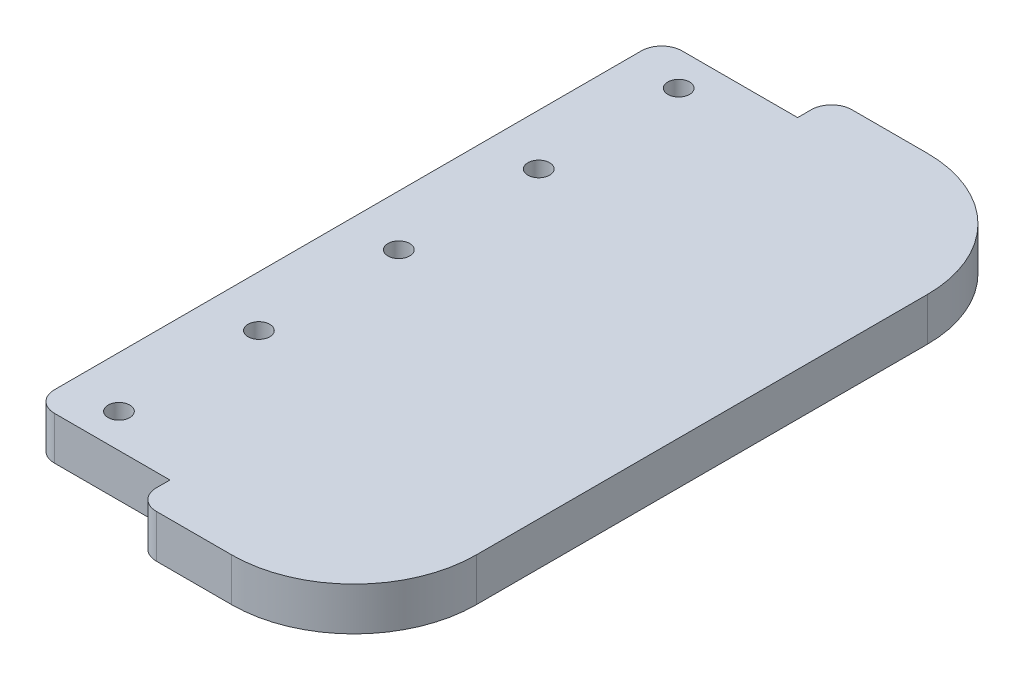
ISO-10303-21;
HEADER;
FILE_DESCRIPTION(('STEP AP214'),'2;1');
FILE_NAME('part.step','',(''),(''),'','','');
FILE_SCHEMA(('AUTOMOTIVE_DESIGN { 1 0 10303 214 1 1 1 1 }'));
ENDSEC;
DATA;
#1=APPLICATION_CONTEXT('core data for automotive mechanical design processes');
#2=APPLICATION_PROTOCOL_DEFINITION('international standard','automotive_design',2000,#1);
#3=PRODUCT_CONTEXT('',#1,'mechanical');
#4=PRODUCT('Part','Part','',(#3));
#5=PRODUCT_RELATED_PRODUCT_CATEGORY('part','',(#4));
#6=PRODUCT_DEFINITION_FORMATION('','',#4);
#7=PRODUCT_DEFINITION_CONTEXT('part definition',#1,'design');
#8=PRODUCT_DEFINITION('design','',#6,#7);
#9=PRODUCT_DEFINITION_SHAPE('','',#8);
#10=(LENGTH_UNIT() NAMED_UNIT(*) SI_UNIT(.MILLI.,.METRE.));
#11=(NAMED_UNIT(*) PLANE_ANGLE_UNIT() SI_UNIT($,.RADIAN.));
#12=(NAMED_UNIT(*) SI_UNIT($,.STERADIAN.) SOLID_ANGLE_UNIT());
#13=UNCERTAINTY_MEASURE_WITH_UNIT(LENGTH_MEASURE(1.E-05),#10,'distance_accuracy_value','');
#14=(GEOMETRIC_REPRESENTATION_CONTEXT(3) GLOBAL_UNCERTAINTY_ASSIGNED_CONTEXT((#13)) GLOBAL_UNIT_ASSIGNED_CONTEXT((#10,
#11,#12)) REPRESENTATION_CONTEXT('',''));
#15=CARTESIAN_POINT('',(0.,0.,0.));
#16=DIRECTION('',(0.,0.,1.));
#17=DIRECTION('',(1.,0.,0.));
#18=AXIS2_PLACEMENT_3D('',#15,#16,#17);
#19=CARTESIAN_POINT('',(0.,6.35,0.));
#20=DIRECTION('',(-1.,0.,0.));
#21=DIRECTION('',(0.,0.,1.));
#22=AXIS2_PLACEMENT_3D('',#19,#20,#21);
#23=PLANE('',#22);
#24=DIRECTION('',(0.,0.,-1.));
#25=VECTOR('',#24,1.);
#26=CARTESIAN_POINT('',(0.,6.35,0.));
#27=LINE('',#26,#25);
#28=CARTESIAN_POINT('',(0.,6.35,-8.));
#29=VERTEX_POINT('',#28);
#30=CARTESIAN_POINT('',(0.,6.35,-94.362));
#31=VERTEX_POINT('',#30);
#32=EDGE_CURVE('E256',#29,#31,#27,.T.);
#33=ORIENTED_EDGE('',*,*,#32,.T.);
#34=DIRECTION('',(0.,-1.,0.));
#35=VECTOR('',#34,1.);
#36=CARTESIAN_POINT('',(0.,6.35,-94.362));
#37=LINE('',#36,#35);
#38=CARTESIAN_POINT('',(0.,0.,-94.362));
#39=VERTEX_POINT('',#38);
#40=EDGE_CURVE('E343',#31,#39,#37,.T.);
#41=ORIENTED_EDGE('',*,*,#40,.T.);
#42=DIRECTION('',(0.,0.,-1.));
#43=VECTOR('',#42,1.);
#44=CARTESIAN_POINT('',(0.,0.,0.));
#45=LINE('',#44,#43);
#46=CARTESIAN_POINT('',(0.,0.,-8.));
#47=VERTEX_POINT('',#46);
#48=EDGE_CURVE('E252',#47,#39,#45,.T.);
#49=ORIENTED_EDGE('',*,*,#48,.F.);
#50=DIRECTION('',(0.,-1.,0.));
#51=VECTOR('',#50,1.);
#52=CARTESIAN_POINT('',(0.,6.35,-8.));
#53=LINE('',#52,#51);
#54=EDGE_CURVE('E340',#47,#29,#53,.F.);
#55=ORIENTED_EDGE('',*,*,#54,.T.);
#56=EDGE_LOOP('',(#33,#41,#49,#55));
#57=FACE_BOUND('',#56,.T.);
#58=ADVANCED_FACE('F41',(#57),#23,.T.);
#59=CARTESIAN_POINT('',(0.,6.35,0.));
#60=DIRECTION('',(0.,0.,-1.));
#61=DIRECTION('',(-1.,0.,0.));
#62=AXIS2_PLACEMENT_3D('',#59,#60,#61);
#63=PLANE('',#62);
#64=DIRECTION('',(1.,0.,0.));
#65=VECTOR('',#64,1.);
#66=CARTESIAN_POINT('',(0.,6.35,0.));
#67=LINE('',#66,#65);
#68=CARTESIAN_POINT('',(23.,6.35,0.));
#69=VERTEX_POINT('',#68);
#70=CARTESIAN_POINT('',(34.084,6.35,0.));
#71=VERTEX_POINT('',#70);
#72=EDGE_CURVE('E267',#69,#71,#67,.T.);
#73=ORIENTED_EDGE('',*,*,#72,.F.);
#74=DIRECTION('',(0.,-1.,0.));
#75=VECTOR('',#74,1.);
#76=CARTESIAN_POINT('',(23.,0.,0.));
#77=LINE('',#76,#75);
#78=CARTESIAN_POINT('',(23.,0.,0.));
#79=VERTEX_POINT('',#78);
#80=EDGE_CURVE('E50',#69,#79,#77,.T.);
#81=ORIENTED_EDGE('',*,*,#80,.T.);
#82=DIRECTION('',(1.,0.,0.));
#83=VECTOR('',#82,1.);
#84=CARTESIAN_POINT('',(0.,0.,0.));
#85=LINE('',#84,#83);
#86=CARTESIAN_POINT('',(34.084,0.,0.));
#87=VERTEX_POINT('',#86);
#88=EDGE_CURVE('E260',#79,#87,#85,.T.);
#89=ORIENTED_EDGE('',*,*,#88,.T.);
#90=DIRECTION('',(0.,-1.,0.));
#91=VECTOR('',#90,1.);
#92=CARTESIAN_POINT('',(34.084,6.35,0.));
#93=LINE('',#92,#91);
#94=EDGE_CURVE('E296',#87,#71,#93,.F.);
#95=ORIENTED_EDGE('',*,*,#94,.T.);
#96=EDGE_LOOP('',(#73,#81,#89,#95));
#97=FACE_BOUND('',#96,.T.);
#98=ADVANCED_FACE('F358',(#97),#63,.F.);
#99=CARTESIAN_POINT('',(0.,6.35,0.));
#100=DIRECTION('',(0.,-1.,0.));
#101=DIRECTION('',(0.,0.,-1.));
#102=AXIS2_PLACEMENT_3D('',#99,#100,#101);
#103=PLANE('',#102);
#104=CARTESIAN_POINT('',(7.50000000000086,6.35,-10.002));
#105=DIRECTION('',(0.,1.,0.));
#106=DIRECTION('',(0.,0.,1.));
#107=AXIS2_PLACEMENT_3D('',#104,#105,#106);
#108=CIRCLE('',#107,1.6);
#109=CARTESIAN_POINT('',(7.50000000000086,6.35,-8.40200000000001));
#110=VERTEX_POINT('',#109);
#111=EDGE_CURVE('E215',#110,#110,#108,.T.);
#112=ORIENTED_EDGE('',*,*,#111,.F.);
#113=EDGE_LOOP('',(#112));
#114=FACE_BOUND('',#113,.T.);
#115=CARTESIAN_POINT('',(7.50000000000065,6.35,-30.592));
#116=DIRECTION('',(0.,1.,0.));
#117=DIRECTION('',(0.,0.,1.));
#118=AXIS2_PLACEMENT_3D('',#115,#116,#117);
#119=CIRCLE('',#118,1.6);
#120=CARTESIAN_POINT('',(7.50000000000065,6.35,-28.992));
#121=VERTEX_POINT('',#120);
#122=EDGE_CURVE('E237',#121,#121,#119,.T.);
#123=ORIENTED_EDGE('',*,*,#122,.F.);
#124=EDGE_LOOP('',(#123));
#125=FACE_BOUND('',#124,.T.);
#126=CARTESIAN_POINT('',(7.50000000000043,6.35,-51.182));
#127=DIRECTION('',(0.,1.,0.));
#128=DIRECTION('',(0.,0.,1.));
#129=AXIS2_PLACEMENT_3D('',#126,#127,#128);
#130=CIRCLE('',#129,1.6);
#131=CARTESIAN_POINT('',(7.50000000000043,6.35,-49.582));
#132=VERTEX_POINT('',#131);
#133=EDGE_CURVE('E229',#132,#132,#130,.T.);
#134=ORIENTED_EDGE('',*,*,#133,.F.);
#135=EDGE_LOOP('',(#134));
#136=FACE_BOUND('',#135,.T.);
#137=CARTESIAN_POINT('',(7.5,6.35,-92.362));
#138=DIRECTION('',(0.,1.,0.));
#139=DIRECTION('',(0.,0.,1.));
#140=AXIS2_PLACEMENT_3D('',#137,#138,#139);
#141=CIRCLE('',#140,1.6);
#142=CARTESIAN_POINT('',(7.5,6.35,-90.762));
#143=VERTEX_POINT('',#142);
#144=EDGE_CURVE('E221',#143,#143,#141,.T.);
#145=ORIENTED_EDGE('',*,*,#144,.F.);
#146=EDGE_LOOP('',(#145));
#147=FACE_BOUND('',#146,.T.);
#148=CARTESIAN_POINT('',(7.50000000000022,6.35,-71.772));
#149=DIRECTION('',(0.,1.,0.));
#150=DIRECTION('',(0.,0.,1.));
#151=AXIS2_PLACEMENT_3D('',#148,#149,#150);
#152=CIRCLE('',#151,1.6);
#153=CARTESIAN_POINT('',(7.50000000000022,6.35,-70.172));
#154=VERTEX_POINT('',#153);
#155=EDGE_CURVE('E248',#154,#154,#152,.T.);
#156=ORIENTED_EDGE('',*,*,#155,.F.);
#157=EDGE_LOOP('',(#156));
#158=FACE_BOUND('',#157,.T.);
#159=DIRECTION('',(1.,0.,0.));
#160=VECTOR('',#159,1.);
#161=CARTESIAN_POINT('',(0.,6.35,-102.362));
#162=LINE('',#161,#160);
#163=CARTESIAN_POINT('',(23.,6.35,-102.362));
#164=VERTEX_POINT('',#163);
#165=CARTESIAN_POINT('',(34.084,6.35,-102.362));
#166=VERTEX_POINT('',#165);
#167=EDGE_CURVE('E259',#164,#166,#162,.T.);
#168=ORIENTED_EDGE('',*,*,#167,.F.);
#169=CARTESIAN_POINT('',(23.,6.35,-99.362));
#170=DIRECTION('',(0.,-1.,0.));
#171=DIRECTION('',(0.,0.,-1.));
#172=AXIS2_PLACEMENT_3D('',#169,#170,#171);
#173=CIRCLE('',#172,3.);
#174=CARTESIAN_POINT('',(20.,6.35,-99.362));
#175=VERTEX_POINT('',#174);
#176=EDGE_CURVE('E337',#164,#175,#173,.F.);
#177=ORIENTED_EDGE('',*,*,#176,.T.);
#178=DIRECTION('',(0.,0.,1.));
#179=VECTOR('',#178,1.);
#180=CARTESIAN_POINT('',(20.,6.35,-102.362));
#181=LINE('',#180,#179);
#182=CARTESIAN_POINT('',(20.,6.35,-97.362));
#183=VERTEX_POINT('',#182);
#184=EDGE_CURVE('E179',#175,#183,#181,.T.);
#185=ORIENTED_EDGE('',*,*,#184,.T.);
#186=DIRECTION('',(1.,0.,0.));
#187=VECTOR('',#186,1.);
#188=CARTESIAN_POINT('',(0.,6.35,-97.362));
#189=LINE('',#188,#187);
#190=CARTESIAN_POINT('',(3.,6.35,-97.362));
#191=VERTEX_POINT('',#190);
#192=EDGE_CURVE('E184',#191,#183,#189,.T.);
#193=ORIENTED_EDGE('',*,*,#192,.F.);
#194=CARTESIAN_POINT('',(3.,6.35,-94.362));
#195=DIRECTION('',(0.,-1.,0.));
#196=DIRECTION('',(0.,0.,-1.));
#197=AXIS2_PLACEMENT_3D('',#194,#195,#196);
#198=CIRCLE('',#197,3.);
#199=EDGE_CURVE('E63',#191,#31,#198,.F.);
#200=ORIENTED_EDGE('',*,*,#199,.T.);
#201=ORIENTED_EDGE('',*,*,#32,.F.);
#202=CARTESIAN_POINT('',(3.,6.35,-8.));
#203=DIRECTION('',(0.,-1.,0.));
#204=DIRECTION('',(0.,0.,-1.));
#205=AXIS2_PLACEMENT_3D('',#202,#203,#204);
#206=CIRCLE('',#205,3.);
#207=CARTESIAN_POINT('',(3.,6.35,-5.));
#208=VERTEX_POINT('',#207);
#209=EDGE_CURVE('E57',#29,#208,#206,.F.);
#210=ORIENTED_EDGE('',*,*,#209,.T.);
#211=DIRECTION('',(-1.,0.,0.));
#212=VECTOR('',#211,1.);
#213=CARTESIAN_POINT('',(20.,6.35,-5.));
#214=LINE('',#213,#212);
#215=CARTESIAN_POINT('',(20.,6.35,-5.));
#216=VERTEX_POINT('',#215);
#217=EDGE_CURVE('E153',#216,#208,#214,.T.);
#218=ORIENTED_EDGE('',*,*,#217,.F.);
#219=DIRECTION('',(0.,0.,-1.));
#220=VECTOR('',#219,1.);
#221=CARTESIAN_POINT('',(20.,6.35,0.));
#222=LINE('',#221,#220);
#223=CARTESIAN_POINT('',(20.,6.35,-3.));
#224=VERTEX_POINT('',#223);
#225=EDGE_CURVE('E144',#224,#216,#222,.T.);
#226=ORIENTED_EDGE('',*,*,#225,.F.);
#227=CARTESIAN_POINT('',(23.,6.35,-3.));
#228=DIRECTION('',(0.,-1.,0.));
#229=DIRECTION('',(0.,0.,-1.));
#230=AXIS2_PLACEMENT_3D('',#227,#228,#229);
#231=CIRCLE('',#230,3.);
#232=EDGE_CURVE('E330',#224,#69,#231,.F.);
#233=ORIENTED_EDGE('',*,*,#232,.T.);
#234=ORIENTED_EDGE('',*,*,#72,.T.);
#235=CARTESIAN_POINT('',(34.084,6.35,-18.));
#236=DIRECTION('',(0.,-1.,0.));
#237=DIRECTION('',(0.,0.,-1.));
#238=AXIS2_PLACEMENT_3D('',#235,#236,#237);
#239=CIRCLE('',#238,18.);
#240=CARTESIAN_POINT('',(52.084,6.35,-18.));
#241=VERTEX_POINT('',#240);
#242=EDGE_CURVE('E304',#71,#241,#239,.F.);
#243=ORIENTED_EDGE('',*,*,#242,.T.);
#244=DIRECTION('',(0.,0.,-1.));
#245=VECTOR('',#244,1.);
#246=CARTESIAN_POINT('',(52.084,6.35,0.));
#247=LINE('',#246,#245);
#248=CARTESIAN_POINT('',(52.084,6.35,-84.362));
#249=VERTEX_POINT('',#248);
#250=EDGE_CURVE('E263',#241,#249,#247,.T.);
#251=ORIENTED_EDGE('',*,*,#250,.T.);
#252=CARTESIAN_POINT('',(34.084,6.35,-84.362));
#253=DIRECTION('',(0.,-1.,0.));
#254=DIRECTION('',(0.,0.,-1.));
#255=AXIS2_PLACEMENT_3D('',#252,#253,#254);
#256=CIRCLE('',#255,18.);
#257=EDGE_CURVE('E300',#249,#166,#256,.F.);
#258=ORIENTED_EDGE('',*,*,#257,.T.);
#259=EDGE_LOOP('',(#168,#177,#185,#193,#200,#201,#210,#218,#226,#233,#234,#243,#251,#258));
#260=FACE_BOUND('',#259,.T.);
#261=ADVANCED_FACE('F165',(#114,#125,#136,#147,#158,#260),#103,.F.);
#262=CARTESIAN_POINT('',(0.,0.,0.));
#263=DIRECTION('',(0.,-1.,0.));
#264=DIRECTION('',(0.,0.,-1.));
#265=AXIS2_PLACEMENT_3D('',#262,#263,#264);
#266=PLANE('',#265);
#267=CARTESIAN_POINT('',(38.876,0.,-6.73));
#268=DIRECTION('',(0.,1.,0.));
#269=DIRECTION('',(0.,0.,1.));
#270=AXIS2_PLACEMENT_3D('',#267,#268,#269);
#271=CIRCLE('',#270,3.45);
#272=CARTESIAN_POINT('',(38.876,0.,-3.28));
#273=VERTEX_POINT('',#272);
#274=EDGE_CURVE('E197',#273,#273,#271,.T.);
#275=ORIENTED_EDGE('',*,*,#274,.T.);
#276=EDGE_LOOP('',(#275));
#277=FACE_BOUND('',#276,.T.);
#278=CARTESIAN_POINT('',(38.876,0.,-95.63));
#279=DIRECTION('',(0.,1.,0.));
#280=DIRECTION('',(0.,0.,1.));
#281=AXIS2_PLACEMENT_3D('',#278,#279,#280);
#282=CIRCLE('',#281,3.45);
#283=CARTESIAN_POINT('',(38.876,0.,-92.18));
#284=VERTEX_POINT('',#283);
#285=EDGE_CURVE('E196',#284,#284,#282,.T.);
#286=ORIENTED_EDGE('',*,*,#285,.T.);
#287=EDGE_LOOP('',(#286));
#288=FACE_BOUND('',#287,.T.);
#289=CARTESIAN_POINT('',(38.876,0.,-51.18));
#290=DIRECTION('',(0.,1.,0.));
#291=DIRECTION('',(0.,0.,1.));
#292=AXIS2_PLACEMENT_3D('',#289,#290,#291);
#293=CIRCLE('',#292,11.684);
#294=CARTESIAN_POINT('',(38.876,0.,-39.496));
#295=VERTEX_POINT('',#294);
#296=EDGE_CURVE('E201',#295,#295,#293,.T.);
#297=ORIENTED_EDGE('',*,*,#296,.T.);
#298=EDGE_LOOP('',(#297));
#299=FACE_BOUND('',#298,.T.);
#300=CARTESIAN_POINT('',(7.50000000000086,0.,-10.002));
#301=DIRECTION('',(0.,1.,0.));
#302=DIRECTION('',(0.,0.,1.));
#303=AXIS2_PLACEMENT_3D('',#300,#301,#302);
#304=CIRCLE('',#303,1.6);
#305=CARTESIAN_POINT('',(7.50000000000086,0.,-8.40200000000001));
#306=VERTEX_POINT('',#305);
#307=EDGE_CURVE('E241',#306,#306,#304,.T.);
#308=ORIENTED_EDGE('',*,*,#307,.T.);
#309=EDGE_LOOP('',(#308));
#310=FACE_BOUND('',#309,.T.);
#311=CARTESIAN_POINT('',(7.50000000000065,0.,-30.592));
#312=DIRECTION('',(0.,1.,0.));
#313=DIRECTION('',(0.,0.,1.));
#314=AXIS2_PLACEMENT_3D('',#311,#312,#313);
#315=CIRCLE('',#314,1.6);
#316=CARTESIAN_POINT('',(7.50000000000065,0.,-28.992));
#317=VERTEX_POINT('',#316);
#318=EDGE_CURVE('E233',#317,#317,#315,.T.);
#319=ORIENTED_EDGE('',*,*,#318,.T.);
#320=EDGE_LOOP('',(#319));
#321=FACE_BOUND('',#320,.T.);
#322=CARTESIAN_POINT('',(7.50000000000043,0.,-51.182));
#323=DIRECTION('',(0.,1.,0.));
#324=DIRECTION('',(0.,0.,1.));
#325=AXIS2_PLACEMENT_3D('',#322,#323,#324);
#326=CIRCLE('',#325,1.6);
#327=CARTESIAN_POINT('',(7.50000000000043,0.,-49.582));
#328=VERTEX_POINT('',#327);
#329=EDGE_CURVE('E225',#328,#328,#326,.T.);
#330=ORIENTED_EDGE('',*,*,#329,.T.);
#331=EDGE_LOOP('',(#330));
#332=FACE_BOUND('',#331,.T.);
#333=CARTESIAN_POINT('',(7.5,0.,-92.362));
#334=DIRECTION('',(0.,1.,0.));
#335=DIRECTION('',(0.,0.,1.));
#336=AXIS2_PLACEMENT_3D('',#333,#334,#335);
#337=CIRCLE('',#336,1.6);
#338=CARTESIAN_POINT('',(7.5,0.,-90.762));
#339=VERTEX_POINT('',#338);
#340=EDGE_CURVE('E216',#339,#339,#337,.T.);
#341=ORIENTED_EDGE('',*,*,#340,.T.);
#342=EDGE_LOOP('',(#341));
#343=FACE_BOUND('',#342,.T.);
#344=CARTESIAN_POINT('',(7.50000000000022,0.,-71.772));
#345=DIRECTION('',(0.,1.,0.));
#346=DIRECTION('',(0.,0.,1.));
#347=AXIS2_PLACEMENT_3D('',#344,#345,#346);
#348=CIRCLE('',#347,1.6);
#349=CARTESIAN_POINT('',(7.50000000000022,0.,-70.172));
#350=VERTEX_POINT('',#349);
#351=EDGE_CURVE('E220',#350,#350,#348,.T.);
#352=ORIENTED_EDGE('',*,*,#351,.T.);
#353=EDGE_LOOP('',(#352));
#354=FACE_BOUND('',#353,.T.);
#355=DIRECTION('',(0.,0.,1.));
#356=VECTOR('',#355,1.);
#357=CARTESIAN_POINT('',(20.,0.,-102.362));
#358=LINE('',#357,#356);
#359=CARTESIAN_POINT('',(20.,0.,-99.362));
#360=VERTEX_POINT('',#359);
#361=CARTESIAN_POINT('',(20.,0.,-97.362));
#362=VERTEX_POINT('',#361);
#363=EDGE_CURVE('E180',#360,#362,#358,.T.);
#364=ORIENTED_EDGE('',*,*,#363,.F.);
#365=CARTESIAN_POINT('',(23.,0.,-99.362));
#366=DIRECTION('',(0.,-1.,0.));
#367=DIRECTION('',(0.,0.,-1.));
#368=AXIS2_PLACEMENT_3D('',#365,#366,#367);
#369=CIRCLE('',#368,3.);
#370=CARTESIAN_POINT('',(23.,0.,-102.362));
#371=VERTEX_POINT('',#370);
#372=EDGE_CURVE('E324',#360,#371,#369,.T.);
#373=ORIENTED_EDGE('',*,*,#372,.T.);
#374=DIRECTION('',(1.,0.,0.));
#375=VECTOR('',#374,1.);
#376=CARTESIAN_POINT('',(0.,0.,-102.362));
#377=LINE('',#376,#375);
#378=CARTESIAN_POINT('',(34.084,0.,-102.362));
#379=VERTEX_POINT('',#378);
#380=EDGE_CURVE('E274',#371,#379,#377,.T.);
#381=ORIENTED_EDGE('',*,*,#380,.T.);
#382=CARTESIAN_POINT('',(34.084,0.,-84.362));
#383=DIRECTION('',(0.,-1.,0.));
#384=DIRECTION('',(0.,0.,-1.));
#385=AXIS2_PLACEMENT_3D('',#382,#383,#384);
#386=CIRCLE('',#385,18.);
#387=CARTESIAN_POINT('',(52.084,0.,-84.362));
#388=VERTEX_POINT('',#387);
#389=EDGE_CURVE('E289',#379,#388,#386,.T.);
#390=ORIENTED_EDGE('',*,*,#389,.T.);
#391=DIRECTION('',(0.,0.,-1.));
#392=VECTOR('',#391,1.);
#393=CARTESIAN_POINT('',(52.084,0.,0.));
#394=LINE('',#393,#392);
#395=CARTESIAN_POINT('',(52.084,0.,-18.));
#396=VERTEX_POINT('',#395);
#397=EDGE_CURVE('E277',#396,#388,#394,.T.);
#398=ORIENTED_EDGE('',*,*,#397,.F.);
#399=CARTESIAN_POINT('',(34.084,0.,-18.));
#400=DIRECTION('',(0.,-1.,0.));
#401=DIRECTION('',(0.,0.,-1.));
#402=AXIS2_PLACEMENT_3D('',#399,#400,#401);
#403=CIRCLE('',#402,18.);
#404=EDGE_CURVE('E292',#396,#87,#403,.T.);
#405=ORIENTED_EDGE('',*,*,#404,.T.);
#406=ORIENTED_EDGE('',*,*,#88,.F.);
#407=CARTESIAN_POINT('',(23.,0.,-3.));
#408=DIRECTION('',(0.,-1.,0.));
#409=DIRECTION('',(0.,0.,-1.));
#410=AXIS2_PLACEMENT_3D('',#407,#408,#409);
#411=CIRCLE('',#410,3.);
#412=CARTESIAN_POINT('',(20.,0.,-3.));
#413=VERTEX_POINT('',#412);
#414=EDGE_CURVE('E315',#79,#413,#411,.T.);
#415=ORIENTED_EDGE('',*,*,#414,.T.);
#416=DIRECTION('',(0.,0.,-1.));
#417=VECTOR('',#416,1.);
#418=CARTESIAN_POINT('',(20.,0.,0.));
#419=LINE('',#418,#417);
#420=CARTESIAN_POINT('',(20.,0.,-5.));
#421=VERTEX_POINT('',#420);
#422=EDGE_CURVE('E167',#413,#421,#419,.T.);
#423=ORIENTED_EDGE('',*,*,#422,.T.);
#424=DIRECTION('',(-1.,0.,0.));
#425=VECTOR('',#424,1.);
#426=CARTESIAN_POINT('',(20.,0.,-5.));
#427=LINE('',#426,#425);
#428=CARTESIAN_POINT('',(3.,0.,-5.));
#429=VERTEX_POINT('',#428);
#430=EDGE_CURVE('E160',#421,#429,#427,.T.);
#431=ORIENTED_EDGE('',*,*,#430,.T.);
#432=CARTESIAN_POINT('',(3.,0.,-8.));
#433=DIRECTION('',(0.,-1.,0.));
#434=DIRECTION('',(0.,0.,-1.));
#435=AXIS2_PLACEMENT_3D('',#432,#433,#434);
#436=CIRCLE('',#435,3.);
#437=EDGE_CURVE('E318',#429,#47,#436,.T.);
#438=ORIENTED_EDGE('',*,*,#437,.T.);
#439=ORIENTED_EDGE('',*,*,#48,.T.);
#440=CARTESIAN_POINT('',(3.,0.,-94.362));
#441=DIRECTION('',(0.,-1.,0.));
#442=DIRECTION('',(0.,0.,-1.));
#443=AXIS2_PLACEMENT_3D('',#440,#441,#442);
#444=CIRCLE('',#443,3.);
#445=CARTESIAN_POINT('',(3.,0.,-97.362));
#446=VERTEX_POINT('',#445);
#447=EDGE_CURVE('E321',#39,#446,#444,.T.);
#448=ORIENTED_EDGE('',*,*,#447,.T.);
#449=DIRECTION('',(1.,0.,0.));
#450=VECTOR('',#449,1.);
#451=CARTESIAN_POINT('',(0.,0.,-97.362));
#452=LINE('',#451,#450);
#453=EDGE_CURVE('E173',#446,#362,#452,.T.);
#454=ORIENTED_EDGE('',*,*,#453,.T.);
#455=EDGE_LOOP('',(#364,#373,#381,#390,#398,#405,#406,#415,#423,#431,#438,#439,#448,#454));
#456=FACE_BOUND('',#455,.T.);
#457=ADVANCED_FACE('F362',(#277,#288,#299,#310,#321,#332,#343,#354,#456),#266,.T.);
#458=CARTESIAN_POINT('',(52.084,6.35,0.));
#459=DIRECTION('',(-1.,0.,0.));
#460=DIRECTION('',(0.,0.,1.));
#461=AXIS2_PLACEMENT_3D('',#458,#459,#460);
#462=PLANE('',#461);
#463=ORIENTED_EDGE('',*,*,#250,.F.);
#464=DIRECTION('',(0.,-1.,0.));
#465=VECTOR('',#464,1.);
#466=CARTESIAN_POINT('',(52.084,6.35,-18.));
#467=LINE('',#466,#465);
#468=EDGE_CURVE('E285',#241,#396,#467,.T.);
#469=ORIENTED_EDGE('',*,*,#468,.T.);
#470=ORIENTED_EDGE('',*,*,#397,.T.);
#471=DIRECTION('',(0.,-1.,0.));
#472=VECTOR('',#471,1.);
#473=CARTESIAN_POINT('',(52.084,6.35,-84.362));
#474=LINE('',#473,#472);
#475=EDGE_CURVE('E270',#388,#249,#474,.F.);
#476=ORIENTED_EDGE('',*,*,#475,.T.);
#477=EDGE_LOOP('',(#463,#469,#470,#476));
#478=FACE_BOUND('',#477,.T.);
#479=ADVANCED_FACE('F372',(#478),#462,.F.);
#480=CARTESIAN_POINT('',(0.,6.35,-102.362));
#481=DIRECTION('',(0.,0.,-1.));
#482=DIRECTION('',(-1.,0.,0.));
#483=AXIS2_PLACEMENT_3D('',#480,#481,#482);
#484=PLANE('',#483);
#485=ORIENTED_EDGE('',*,*,#380,.F.);
#486=DIRECTION('',(0.,-1.,0.));
#487=VECTOR('',#486,1.);
#488=CARTESIAN_POINT('',(23.,6.35,-102.362));
#489=LINE('',#488,#487);
#490=EDGE_CURVE('E327',#371,#164,#489,.F.);
#491=ORIENTED_EDGE('',*,*,#490,.T.);
#492=ORIENTED_EDGE('',*,*,#167,.T.);
#493=DIRECTION('',(0.,-1.,0.));
#494=VECTOR('',#493,1.);
#495=CARTESIAN_POINT('',(34.084,0.,-102.362));
#496=LINE('',#495,#494);
#497=EDGE_CURVE('E307',#166,#379,#496,.T.);
#498=ORIENTED_EDGE('',*,*,#497,.T.);
#499=EDGE_LOOP('',(#485,#491,#492,#498));
#500=FACE_BOUND('',#499,.T.);
#501=ADVANCED_FACE('F415',(#500),#484,.T.);
#502=CARTESIAN_POINT('',(7.50000000000022,6.35,-71.772));
#503=DIRECTION('',(0.,-1.,0.));
#504=DIRECTION('',(0.,0.,-1.));
#505=AXIS2_PLACEMENT_3D('',#502,#503,#504);
#506=CYLINDRICAL_SURFACE('',#505,1.6);
#507=ORIENTED_EDGE('',*,*,#155,.T.);
#508=EDGE_LOOP('',(#507));
#509=FACE_BOUND('',#508,.T.);
#510=ORIENTED_EDGE('',*,*,#351,.F.);
#511=EDGE_LOOP('',(#510));
#512=FACE_BOUND('',#511,.T.);
#513=ADVANCED_FACE('F464',(#509,#512),#506,.F.);
#514=CARTESIAN_POINT('',(7.5,6.35,-92.362));
#515=DIRECTION('',(0.,-1.,0.));
#516=DIRECTION('',(0.,0.,-1.));
#517=AXIS2_PLACEMENT_3D('',#514,#515,#516);
#518=CYLINDRICAL_SURFACE('',#517,1.6);
#519=ORIENTED_EDGE('',*,*,#144,.T.);
#520=EDGE_LOOP('',(#519));
#521=FACE_BOUND('',#520,.T.);
#522=ORIENTED_EDGE('',*,*,#340,.F.);
#523=EDGE_LOOP('',(#522));
#524=FACE_BOUND('',#523,.T.);
#525=ADVANCED_FACE('F460',(#521,#524),#518,.F.);
#526=CARTESIAN_POINT('',(7.50000000000043,6.35,-51.182));
#527=DIRECTION('',(0.,-1.,0.));
#528=DIRECTION('',(0.,0.,-1.));
#529=AXIS2_PLACEMENT_3D('',#526,#527,#528);
#530=CYLINDRICAL_SURFACE('',#529,1.6);
#531=ORIENTED_EDGE('',*,*,#133,.T.);
#532=EDGE_LOOP('',(#531));
#533=FACE_BOUND('',#532,.T.);
#534=ORIENTED_EDGE('',*,*,#329,.F.);
#535=EDGE_LOOP('',(#534));
#536=FACE_BOUND('',#535,.T.);
#537=ADVANCED_FACE('F463',(#533,#536),#530,.F.);
#538=CARTESIAN_POINT('',(7.50000000000065,6.35,-30.592));
#539=DIRECTION('',(0.,-1.,0.));
#540=DIRECTION('',(0.,0.,-1.));
#541=AXIS2_PLACEMENT_3D('',#538,#539,#540);
#542=CYLINDRICAL_SURFACE('',#541,1.6);
#543=ORIENTED_EDGE('',*,*,#122,.T.);
#544=EDGE_LOOP('',(#543));
#545=FACE_BOUND('',#544,.T.);
#546=ORIENTED_EDGE('',*,*,#318,.F.);
#547=EDGE_LOOP('',(#546));
#548=FACE_BOUND('',#547,.T.);
#549=ADVANCED_FACE('F468',(#545,#548),#542,.F.);
#550=CARTESIAN_POINT('',(7.50000000000086,6.35,-10.002));
#551=DIRECTION('',(0.,-1.,0.));
#552=DIRECTION('',(0.,0.,-1.));
#553=AXIS2_PLACEMENT_3D('',#550,#551,#552);
#554=CYLINDRICAL_SURFACE('',#553,1.6);
#555=ORIENTED_EDGE('',*,*,#111,.T.);
#556=EDGE_LOOP('',(#555));
#557=FACE_BOUND('',#556,.T.);
#558=ORIENTED_EDGE('',*,*,#307,.F.);
#559=EDGE_LOOP('',(#558));
#560=FACE_BOUND('',#559,.T.);
#561=ADVANCED_FACE('F458',(#557,#560),#554,.F.);
#562=CARTESIAN_POINT('',(38.876,39.3973425255345,-51.18));
#563=DIRECTION('',(0.,-1.,0.));
#564=DIRECTION('',(0.,0.,-1.));
#565=AXIS2_PLACEMENT_3D('',#562,#563,#564);
#566=CYLINDRICAL_SURFACE('',#565,11.684);
#567=CARTESIAN_POINT('',(38.876,4.7625,-51.18));
#568=DIRECTION('',(0.,-1.,0.));
#569=DIRECTION('',(0.,0.,-1.));
#570=AXIS2_PLACEMENT_3D('',#567,#568,#569);
#571=CIRCLE('',#570,11.684);
#572=CARTESIAN_POINT('',(38.876,4.7625,-62.864));
#573=VERTEX_POINT('',#572);
#574=EDGE_CURVE('E211',#573,#573,#571,.T.);
#575=ORIENTED_EDGE('',*,*,#574,.F.);
#576=EDGE_LOOP('',(#575));
#577=FACE_BOUND('',#576,.T.);
#578=ORIENTED_EDGE('',*,*,#296,.F.);
#579=EDGE_LOOP('',(#578));
#580=FACE_BOUND('',#579,.T.);
#581=ADVANCED_FACE('F454',(#577,#580),#566,.F.);
#582=CARTESIAN_POINT('',(0.,4.7625,0.));
#583=DIRECTION('',(0.,-1.,0.));
#584=DIRECTION('',(0.,0.,-1.));
#585=AXIS2_PLACEMENT_3D('',#582,#583,#584);
#586=PLANE('',#585);
#587=ORIENTED_EDGE('',*,*,#574,.T.);
#588=EDGE_LOOP('',(#587));
#589=FACE_BOUND('',#588,.T.);
#590=ADVANCED_FACE('F440',(#589),#586,.T.);
#591=CARTESIAN_POINT('',(38.876,39.3973425255345,-95.63));
#592=DIRECTION('',(0.,-1.,0.));
#593=DIRECTION('',(0.,0.,-1.));
#594=AXIS2_PLACEMENT_3D('',#591,#592,#593);
#595=CYLINDRICAL_SURFACE('',#594,3.45);
#596=CARTESIAN_POINT('',(38.876,4.7625,-95.63));
#597=DIRECTION('',(0.,-1.,0.));
#598=DIRECTION('',(0.,0.,-1.));
#599=AXIS2_PLACEMENT_3D('',#596,#597,#598);
#600=CIRCLE('',#599,3.45);
#601=CARTESIAN_POINT('',(38.876,4.7625,-99.08));
#602=VERTEX_POINT('',#601);
#603=EDGE_CURVE('E192',#602,#602,#600,.T.);
#604=ORIENTED_EDGE('',*,*,#603,.F.);
#605=EDGE_LOOP('',(#604));
#606=FACE_BOUND('',#605,.T.);
#607=ORIENTED_EDGE('',*,*,#285,.F.);
#608=EDGE_LOOP('',(#607));
#609=FACE_BOUND('',#608,.T.);
#610=ADVANCED_FACE('F436',(#606,#609),#595,.F.);
#611=CARTESIAN_POINT('',(0.,4.7625,0.));
#612=DIRECTION('',(0.,-1.,0.));
#613=DIRECTION('',(0.,0.,-1.));
#614=AXIS2_PLACEMENT_3D('',#611,#612,#613);
#615=PLANE('',#614);
#616=ORIENTED_EDGE('',*,*,#603,.T.);
#617=EDGE_LOOP('',(#616));
#618=FACE_BOUND('',#617,.T.);
#619=ADVANCED_FACE('F439',(#618),#615,.T.);
#620=CARTESIAN_POINT('',(38.876,39.3973425255345,-6.73));
#621=DIRECTION('',(0.,-1.,0.));
#622=DIRECTION('',(0.,0.,-1.));
#623=AXIS2_PLACEMENT_3D('',#620,#621,#622);
#624=CYLINDRICAL_SURFACE('',#623,3.45);
#625=CARTESIAN_POINT('',(38.876,4.7625,-6.73));
#626=DIRECTION('',(0.,-1.,0.));
#627=DIRECTION('',(0.,0.,-1.));
#628=AXIS2_PLACEMENT_3D('',#625,#626,#627);
#629=CIRCLE('',#628,3.45);
#630=CARTESIAN_POINT('',(38.876,4.7625,-10.18));
#631=VERTEX_POINT('',#630);
#632=EDGE_CURVE('E162',#631,#631,#629,.T.);
#633=ORIENTED_EDGE('',*,*,#632,.F.);
#634=EDGE_LOOP('',(#633));
#635=FACE_BOUND('',#634,.T.);
#636=ORIENTED_EDGE('',*,*,#274,.F.);
#637=EDGE_LOOP('',(#636));
#638=FACE_BOUND('',#637,.T.);
#639=ADVANCED_FACE('F444',(#635,#638),#624,.F.);
#640=CARTESIAN_POINT('',(0.,4.7625,0.));
#641=DIRECTION('',(0.,-1.,0.));
#642=DIRECTION('',(0.,0.,-1.));
#643=AXIS2_PLACEMENT_3D('',#640,#641,#642);
#644=PLANE('',#643);
#645=ORIENTED_EDGE('',*,*,#632,.T.);
#646=EDGE_LOOP('',(#645));
#647=FACE_BOUND('',#646,.T.);
#648=ADVANCED_FACE('F419',(#647),#644,.T.);
#649=CARTESIAN_POINT('',(34.084,6.35,-18.));
#650=DIRECTION('',(0.,-1.,0.));
#651=DIRECTION('',(0.,0.,-1.));
#652=AXIS2_PLACEMENT_3D('',#649,#650,#651);
#653=CYLINDRICAL_SURFACE('',#652,18.);
#654=ORIENTED_EDGE('',*,*,#242,.F.);
#655=ORIENTED_EDGE('',*,*,#94,.F.);
#656=ORIENTED_EDGE('',*,*,#404,.F.);
#657=ORIENTED_EDGE('',*,*,#468,.F.);
#658=EDGE_LOOP('',(#654,#655,#656,#657));
#659=FACE_BOUND('',#658,.T.);
#660=ADVANCED_FACE('F368',(#659),#653,.T.);
#661=CARTESIAN_POINT('',(34.084,6.35,-84.362));
#662=DIRECTION('',(0.,1.,0.));
#663=DIRECTION('',(0.,0.,1.));
#664=AXIS2_PLACEMENT_3D('',#661,#662,#663);
#665=CYLINDRICAL_SURFACE('',#664,18.);
#666=ORIENTED_EDGE('',*,*,#257,.F.);
#667=ORIENTED_EDGE('',*,*,#475,.F.);
#668=ORIENTED_EDGE('',*,*,#389,.F.);
#669=ORIENTED_EDGE('',*,*,#497,.F.);
#670=EDGE_LOOP('',(#666,#667,#668,#669));
#671=FACE_BOUND('',#670,.T.);
#672=ADVANCED_FACE('F376',(#671),#665,.T.);
#673=CARTESIAN_POINT('',(0.,6.35,-97.362));
#674=DIRECTION('',(0.,0.,-1.));
#675=DIRECTION('',(-1.,0.,0.));
#676=AXIS2_PLACEMENT_3D('',#673,#674,#675);
#677=PLANE('',#676);
#678=ORIENTED_EDGE('',*,*,#453,.F.);
#679=DIRECTION('',(0.,-1.,0.));
#680=VECTOR('',#679,1.);
#681=CARTESIAN_POINT('',(3.,6.35,-97.362));
#682=LINE('',#681,#680);
#683=EDGE_CURVE('E347',#446,#191,#682,.F.);
#684=ORIENTED_EDGE('',*,*,#683,.T.);
#685=ORIENTED_EDGE('',*,*,#192,.T.);
#686=DIRECTION('',(0.,-1.,0.));
#687=VECTOR('',#686,1.);
#688=CARTESIAN_POINT('',(20.,6.35,-97.362));
#689=LINE('',#688,#687);
#690=EDGE_CURVE('E175',#183,#362,#689,.T.);
#691=ORIENTED_EDGE('',*,*,#690,.T.);
#692=EDGE_LOOP('',(#678,#684,#685,#691));
#693=FACE_BOUND('',#692,.T.);
#694=ADVANCED_FACE('F392',(#693),#677,.T.);
#695=CARTESIAN_POINT('',(20.,6.35,-102.362));
#696=DIRECTION('',(1.,0.,0.));
#697=DIRECTION('',(0.,0.,-1.));
#698=AXIS2_PLACEMENT_3D('',#695,#696,#697);
#699=PLANE('',#698);
#700=ORIENTED_EDGE('',*,*,#184,.F.);
#701=DIRECTION('',(0.,-1.,0.));
#702=VECTOR('',#701,1.);
#703=CARTESIAN_POINT('',(20.,0.,-99.362));
#704=LINE('',#703,#702);
#705=EDGE_CURVE('E311',#175,#360,#704,.T.);
#706=ORIENTED_EDGE('',*,*,#705,.T.);
#707=ORIENTED_EDGE('',*,*,#363,.T.);
#708=ORIENTED_EDGE('',*,*,#690,.F.);
#709=EDGE_LOOP('',(#700,#706,#707,#708));
#710=FACE_BOUND('',#709,.T.);
#711=ADVANCED_FACE('F386',(#710),#699,.F.);
#712=CARTESIAN_POINT('',(20.,6.35,0.));
#713=DIRECTION('',(-1.,0.,0.));
#714=DIRECTION('',(0.,0.,1.));
#715=AXIS2_PLACEMENT_3D('',#712,#713,#714);
#716=PLANE('',#715);
#717=ORIENTED_EDGE('',*,*,#422,.F.);
#718=DIRECTION('',(0.,-1.,0.));
#719=VECTOR('',#718,1.);
#720=CARTESIAN_POINT('',(20.,6.35,-3.));
#721=LINE('',#720,#719);
#722=EDGE_CURVE('E12',#413,#224,#721,.F.);
#723=ORIENTED_EDGE('',*,*,#722,.T.);
#724=ORIENTED_EDGE('',*,*,#225,.T.);
#725=DIRECTION('',(0.,-1.,0.));
#726=VECTOR('',#725,1.);
#727=CARTESIAN_POINT('',(20.,6.35,-5.));
#728=LINE('',#727,#726);
#729=EDGE_CURVE('E148',#216,#421,#728,.T.);
#730=ORIENTED_EDGE('',*,*,#729,.T.);
#731=EDGE_LOOP('',(#717,#723,#724,#730));
#732=FACE_BOUND('',#731,.T.);
#733=ADVANCED_FACE('F147',(#732),#716,.T.);
#734=CARTESIAN_POINT('',(20.,6.35,-5.));
#735=DIRECTION('',(0.,0.,1.));
#736=DIRECTION('',(1.,0.,0.));
#737=AXIS2_PLACEMENT_3D('',#734,#735,#736);
#738=PLANE('',#737);
#739=ORIENTED_EDGE('',*,*,#217,.T.);
#740=DIRECTION('',(0.,-1.,0.));
#741=VECTOR('',#740,1.);
#742=CARTESIAN_POINT('',(3.,6.35,-5.));
#743=LINE('',#742,#741);
#744=EDGE_CURVE('E350',#208,#429,#743,.T.);
#745=ORIENTED_EDGE('',*,*,#744,.T.);
#746=ORIENTED_EDGE('',*,*,#430,.F.);
#747=ORIENTED_EDGE('',*,*,#729,.F.);
#748=EDGE_LOOP('',(#739,#745,#746,#747));
#749=FACE_BOUND('',#748,.T.);
#750=ADVANCED_FACE('F156',(#749),#738,.T.);
#751=CARTESIAN_POINT('',(23.,6.35,-99.362));
#752=DIRECTION('',(0.,1.,0.));
#753=DIRECTION('',(0.,0.,1.));
#754=AXIS2_PLACEMENT_3D('',#751,#752,#753);
#755=CYLINDRICAL_SURFACE('',#754,3.);
#756=ORIENTED_EDGE('',*,*,#176,.F.);
#757=ORIENTED_EDGE('',*,*,#490,.F.);
#758=ORIENTED_EDGE('',*,*,#372,.F.);
#759=ORIENTED_EDGE('',*,*,#705,.F.);
#760=EDGE_LOOP('',(#756,#757,#758,#759));
#761=FACE_BOUND('',#760,.T.);
#762=ADVANCED_FACE('F384',(#761),#755,.T.);
#763=CARTESIAN_POINT('',(3.,6.35,-94.362));
#764=DIRECTION('',(0.,-1.,0.));
#765=DIRECTION('',(0.,0.,-1.));
#766=AXIS2_PLACEMENT_3D('',#763,#764,#765);
#767=CYLINDRICAL_SURFACE('',#766,3.);
#768=ORIENTED_EDGE('',*,*,#199,.F.);
#769=ORIENTED_EDGE('',*,*,#683,.F.);
#770=ORIENTED_EDGE('',*,*,#447,.F.);
#771=ORIENTED_EDGE('',*,*,#40,.F.);
#772=EDGE_LOOP('',(#768,#769,#770,#771));
#773=FACE_BOUND('',#772,.T.);
#774=ADVANCED_FACE('F394',(#773),#767,.T.);
#775=CARTESIAN_POINT('',(3.,6.35,-8.));
#776=DIRECTION('',(0.,-1.,0.));
#777=DIRECTION('',(0.,0.,-1.));
#778=AXIS2_PLACEMENT_3D('',#775,#776,#777);
#779=CYLINDRICAL_SURFACE('',#778,3.);
#780=ORIENTED_EDGE('',*,*,#209,.F.);
#781=ORIENTED_EDGE('',*,*,#54,.F.);
#782=ORIENTED_EDGE('',*,*,#437,.F.);
#783=ORIENTED_EDGE('',*,*,#744,.F.);
#784=EDGE_LOOP('',(#780,#781,#782,#783));
#785=FACE_BOUND('',#784,.T.);
#786=ADVANCED_FACE('F400',(#785),#779,.T.);
#787=CARTESIAN_POINT('',(23.,6.35,-3.));
#788=DIRECTION('',(0.,1.,0.));
#789=DIRECTION('',(0.,0.,1.));
#790=AXIS2_PLACEMENT_3D('',#787,#788,#789);
#791=CYLINDRICAL_SURFACE('',#790,3.);
#792=ORIENTED_EDGE('',*,*,#232,.F.);
#793=ORIENTED_EDGE('',*,*,#722,.F.);
#794=ORIENTED_EDGE('',*,*,#414,.F.);
#795=ORIENTED_EDGE('',*,*,#80,.F.);
#796=EDGE_LOOP('',(#792,#793,#794,#795));
#797=FACE_BOUND('',#796,.T.);
#798=ADVANCED_FACE('F43',(#797),#791,.T.);
#799=CLOSED_SHELL('',(#58,#98,#261,#457,#479,#501,#513,#525,#537,#549,#561,#581,#590,#610,#619,
#639,#648,#660,#672,#694,#711,#733,#750,#762,#774,#786,#798));
#800=MANIFOLD_SOLID_BREP('B2',#799);
#801=ADVANCED_BREP_SHAPE_REPRESENTATION('',(#18,#800),#14);
#802=SHAPE_DEFINITION_REPRESENTATION(#9,#801);
ENDSEC;
END-ISO-10303-21;
